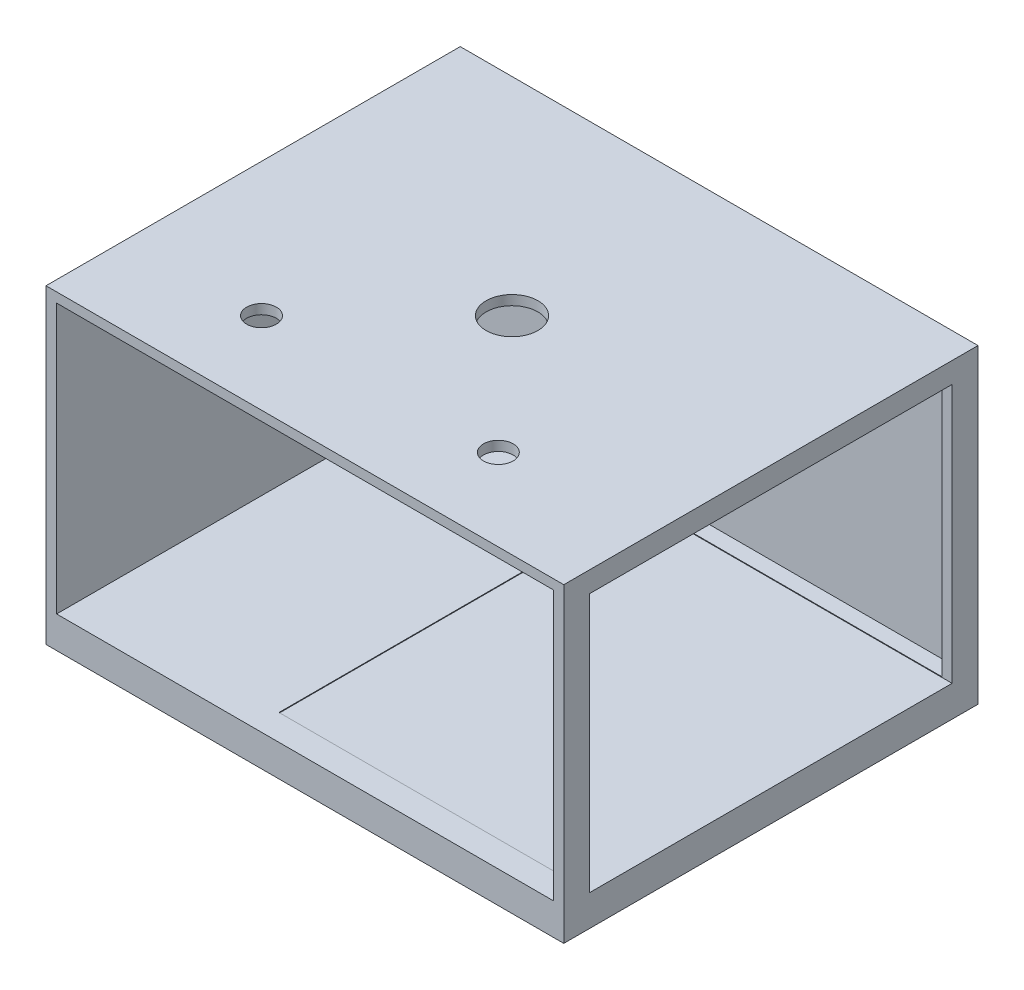
ISO-10303-21;
HEADER;
FILE_DESCRIPTION(('STEP AP214'),'2;1');
FILE_NAME('part.step','',(''),(''),'','','');
FILE_SCHEMA(('AUTOMOTIVE_DESIGN { 1 0 10303 214 1 1 1 1 }'));
ENDSEC;
DATA;
#1=APPLICATION_CONTEXT('core data for automotive mechanical design processes');
#2=APPLICATION_PROTOCOL_DEFINITION('international standard','automotive_design',2000,#1);
#3=PRODUCT_CONTEXT('',#1,'mechanical');
#4=PRODUCT('Part','Part','',(#3));
#5=PRODUCT_RELATED_PRODUCT_CATEGORY('part','',(#4));
#6=PRODUCT_DEFINITION_FORMATION('','',#4);
#7=PRODUCT_DEFINITION_CONTEXT('part definition',#1,'design');
#8=PRODUCT_DEFINITION('design','',#6,#7);
#9=PRODUCT_DEFINITION_SHAPE('','',#8);
#10=(LENGTH_UNIT() NAMED_UNIT(*) SI_UNIT(.MILLI.,.METRE.));
#11=(NAMED_UNIT(*) PLANE_ANGLE_UNIT() SI_UNIT($,.RADIAN.));
#12=(NAMED_UNIT(*) SI_UNIT($,.STERADIAN.) SOLID_ANGLE_UNIT());
#13=UNCERTAINTY_MEASURE_WITH_UNIT(LENGTH_MEASURE(1.E-05),#10,'distance_accuracy_value','');
#14=(GEOMETRIC_REPRESENTATION_CONTEXT(3) GLOBAL_UNCERTAINTY_ASSIGNED_CONTEXT((#13)) GLOBAL_UNIT_ASSIGNED_CONTEXT((#10,
#11,#12)) REPRESENTATION_CONTEXT('',''));
#15=CARTESIAN_POINT('',(0.,0.,0.));
#16=DIRECTION('',(0.,0.,1.));
#17=DIRECTION('',(1.,0.,0.));
#18=AXIS2_PLACEMENT_3D('',#15,#16,#17);
#19=CARTESIAN_POINT('',(250.,300.,-200.));
#20=DIRECTION('',(-1.,0.,0.));
#21=DIRECTION('',(0.,0.,1.));
#22=AXIS2_PLACEMENT_3D('',#19,#20,#21);
#23=PLANE('',#22);
#24=DIRECTION('',(0.,0.,1.));
#25=VECTOR('',#24,1.);
#26=CARTESIAN_POINT('',(250.,280.,175.));
#27=LINE('',#26,#25);
#28=CARTESIAN_POINT('',(250.,280.,-175.));
#29=VERTEX_POINT('',#28);
#30=CARTESIAN_POINT('',(250.,280.,175.));
#31=VERTEX_POINT('',#30);
#32=EDGE_CURVE('E163',#29,#31,#27,.T.);
#33=ORIENTED_EDGE('',*,*,#32,.F.);
#34=DIRECTION('',(0.,1.,0.));
#35=VECTOR('',#34,1.);
#36=CARTESIAN_POINT('',(250.,280.,-175.));
#37=LINE('',#36,#35);
#38=CARTESIAN_POINT('',(250.,30.,-175.));
#39=VERTEX_POINT('',#38);
#40=EDGE_CURVE('E49',#39,#29,#37,.T.);
#41=ORIENTED_EDGE('',*,*,#40,.F.);
#42=DIRECTION('',(0.,0.,-1.));
#43=VECTOR('',#42,1.);
#44=CARTESIAN_POINT('',(250.,30.,175.));
#45=LINE('',#44,#43);
#46=CARTESIAN_POINT('',(250.,30.,175.));
#47=VERTEX_POINT('',#46);
#48=EDGE_CURVE('E168',#47,#39,#45,.T.);
#49=ORIENTED_EDGE('',*,*,#48,.F.);
#50=DIRECTION('',(0.,-1.,0.));
#51=VECTOR('',#50,1.);
#52=CARTESIAN_POINT('',(250.,280.,175.));
#53=LINE('',#52,#51);
#54=EDGE_CURVE('E149',#31,#47,#53,.T.);
#55=ORIENTED_EDGE('',*,*,#54,.F.);
#56=EDGE_LOOP('',(#33,#41,#49,#55));
#57=FACE_BOUND('',#56,.T.);
#58=DIRECTION('',(0.,0.,-1.));
#59=VECTOR('',#58,1.);
#60=CARTESIAN_POINT('',(250.,0.,-200.));
#61=LINE('',#60,#59);
#62=CARTESIAN_POINT('',(250.,0.,200.));
#63=VERTEX_POINT('',#62);
#64=CARTESIAN_POINT('',(250.,0.,-200.));
#65=VERTEX_POINT('',#64);
#66=EDGE_CURVE('E205',#63,#65,#61,.T.);
#67=ORIENTED_EDGE('',*,*,#66,.T.);
#68=DIRECTION('',(0.,-1.,0.));
#69=VECTOR('',#68,1.);
#70=CARTESIAN_POINT('',(250.,300.,-200.));
#71=LINE('',#70,#69);
#72=CARTESIAN_POINT('',(250.,300.,-200.));
#73=VERTEX_POINT('',#72);
#74=EDGE_CURVE('E239',#73,#65,#71,.T.);
#75=ORIENTED_EDGE('',*,*,#74,.F.);
#76=DIRECTION('',(0.,0.,-1.));
#77=VECTOR('',#76,1.);
#78=CARTESIAN_POINT('',(250.,300.,-200.));
#79=LINE('',#78,#77);
#80=CARTESIAN_POINT('',(250.,300.,200.));
#81=VERTEX_POINT('',#80);
#82=EDGE_CURVE('E213',#81,#73,#79,.T.);
#83=ORIENTED_EDGE('',*,*,#82,.F.);
#84=DIRECTION('',(0.,-1.,0.));
#85=VECTOR('',#84,1.);
#86=CARTESIAN_POINT('',(250.,300.,200.));
#87=LINE('',#86,#85);
#88=EDGE_CURVE('E223',#81,#63,#87,.T.);
#89=ORIENTED_EDGE('',*,*,#88,.T.);
#90=EDGE_LOOP('',(#67,#75,#83,#89));
#91=FACE_BOUND('',#90,.T.);
#92=ADVANCED_FACE('F33',(#57,#91),#23,.F.);
#93=CARTESIAN_POINT('',(-250.,300.,-200.));
#94=DIRECTION('',(0.,0.,1.));
#95=DIRECTION('',(1.,0.,0.));
#96=AXIS2_PLACEMENT_3D('',#93,#94,#95);
#97=PLANE('',#96);
#98=DIRECTION('',(-1.,0.,0.));
#99=VECTOR('',#98,1.);
#100=CARTESIAN_POINT('',(-250.,0.,-200.));
#101=LINE('',#100,#99);
#102=CARTESIAN_POINT('',(-250.,0.,-200.));
#103=VERTEX_POINT('',#102);
#104=EDGE_CURVE('E226',#65,#103,#101,.T.);
#105=ORIENTED_EDGE('',*,*,#104,.T.);
#106=DIRECTION('',(0.,-1.,0.));
#107=VECTOR('',#106,1.);
#108=CARTESIAN_POINT('',(-250.,300.,-200.));
#109=LINE('',#108,#107);
#110=CARTESIAN_POINT('',(-250.,300.,-200.));
#111=VERTEX_POINT('',#110);
#112=EDGE_CURVE('E236',#111,#103,#109,.T.);
#113=ORIENTED_EDGE('',*,*,#112,.F.);
#114=DIRECTION('',(-1.,0.,0.));
#115=VECTOR('',#114,1.);
#116=CARTESIAN_POINT('',(-250.,300.,-200.));
#117=LINE('',#116,#115);
#118=EDGE_CURVE('E216',#73,#111,#117,.T.);
#119=ORIENTED_EDGE('',*,*,#118,.F.);
#120=ORIENTED_EDGE('',*,*,#74,.T.);
#121=EDGE_LOOP('',(#105,#113,#119,#120));
#122=FACE_BOUND('',#121,.T.);
#123=ADVANCED_FACE('F284',(#122),#97,.F.);
#124=CARTESIAN_POINT('',(-250.,300.,-200.));
#125=DIRECTION('',(1.,0.,0.));
#126=DIRECTION('',(0.,0.,-1.));
#127=AXIS2_PLACEMENT_3D('',#124,#125,#126);
#128=PLANE('',#127);
#129=DIRECTION('',(0.,0.,1.));
#130=VECTOR('',#129,1.);
#131=CARTESIAN_POINT('',(-250.,0.,-200.));
#132=LINE('',#131,#130);
#133=CARTESIAN_POINT('',(-250.,0.,200.));
#134=VERTEX_POINT('',#133);
#135=EDGE_CURVE('E228',#103,#134,#132,.T.);
#136=ORIENTED_EDGE('',*,*,#135,.T.);
#137=DIRECTION('',(0.,-1.,0.));
#138=VECTOR('',#137,1.);
#139=CARTESIAN_POINT('',(-250.,300.,200.));
#140=LINE('',#139,#138);
#141=CARTESIAN_POINT('',(-250.,300.,200.));
#142=VERTEX_POINT('',#141);
#143=EDGE_CURVE('E233',#142,#134,#140,.T.);
#144=ORIENTED_EDGE('',*,*,#143,.F.);
#145=DIRECTION('',(0.,0.,1.));
#146=VECTOR('',#145,1.);
#147=CARTESIAN_POINT('',(-250.,300.,-200.));
#148=LINE('',#147,#146);
#149=EDGE_CURVE('E219',#111,#142,#148,.T.);
#150=ORIENTED_EDGE('',*,*,#149,.F.);
#151=ORIENTED_EDGE('',*,*,#112,.T.);
#152=EDGE_LOOP('',(#136,#144,#150,#151));
#153=FACE_BOUND('',#152,.T.);
#154=ADVANCED_FACE('F289',(#153),#128,.F.);
#155=CARTESIAN_POINT('',(-250.,300.,200.));
#156=DIRECTION('',(0.,0.,-1.));
#157=DIRECTION('',(-1.,0.,0.));
#158=AXIS2_PLACEMENT_3D('',#155,#156,#157);
#159=PLANE('',#158);
#160=DIRECTION('',(-1.,0.,0.));
#161=VECTOR('',#160,1.);
#162=CARTESIAN_POINT('',(-239.738944774916,290.632083078125,200.));
#163=LINE('',#162,#161);
#164=CARTESIAN_POINT('',(240.261055225084,290.632083078125,200.));
#165=VERTEX_POINT('',#164);
#166=CARTESIAN_POINT('',(-239.738944774916,290.632083078125,200.));
#167=VERTEX_POINT('',#166);
#168=EDGE_CURVE('E194',#165,#167,#163,.T.);
#169=ORIENTED_EDGE('',*,*,#168,.F.);
#170=DIRECTION('',(0.,1.,0.));
#171=VECTOR('',#170,1.);
#172=CARTESIAN_POINT('',(240.261055225084,290.632083078125,200.));
#173=LINE('',#172,#171);
#174=CARTESIAN_POINT('',(240.261055225084,30.6320830781249,200.));
#175=VERTEX_POINT('',#174);
#176=EDGE_CURVE('E178',#175,#165,#173,.T.);
#177=ORIENTED_EDGE('',*,*,#176,.F.);
#178=DIRECTION('',(1.,0.,0.));
#179=VECTOR('',#178,1.);
#180=CARTESIAN_POINT('',(-239.738944774916,30.6320830781249,200.));
#181=LINE('',#180,#179);
#182=CARTESIAN_POINT('',(-239.738944774916,30.6320830781249,200.));
#183=VERTEX_POINT('',#182);
#184=EDGE_CURVE('E183',#183,#175,#181,.T.);
#185=ORIENTED_EDGE('',*,*,#184,.F.);
#186=DIRECTION('',(0.,-1.,0.));
#187=VECTOR('',#186,1.);
#188=CARTESIAN_POINT('',(-239.738944774916,290.632083078125,200.));
#189=LINE('',#188,#187);
#190=EDGE_CURVE('E197',#167,#183,#189,.T.);
#191=ORIENTED_EDGE('',*,*,#190,.F.);
#192=EDGE_LOOP('',(#169,#177,#185,#191));
#193=FACE_BOUND('',#192,.T.);
#194=DIRECTION('',(1.,0.,0.));
#195=VECTOR('',#194,1.);
#196=CARTESIAN_POINT('',(-250.,0.,200.));
#197=LINE('',#196,#195);
#198=EDGE_CURVE('E217',#134,#63,#197,.T.);
#199=ORIENTED_EDGE('',*,*,#198,.T.);
#200=ORIENTED_EDGE('',*,*,#88,.F.);
#201=DIRECTION('',(1.,0.,0.));
#202=VECTOR('',#201,1.);
#203=CARTESIAN_POINT('',(-250.,300.,200.));
#204=LINE('',#203,#202);
#205=EDGE_CURVE('E221',#142,#81,#204,.T.);
#206=ORIENTED_EDGE('',*,*,#205,.F.);
#207=ORIENTED_EDGE('',*,*,#143,.T.);
#208=EDGE_LOOP('',(#199,#200,#206,#207));
#209=FACE_BOUND('',#208,.T.);
#210=ADVANCED_FACE('F273',(#193,#209),#159,.F.);
#211=CARTESIAN_POINT('',(0.,300.,0.));
#212=DIRECTION('',(0.,1.,0.));
#213=DIRECTION('',(0.,0.,1.));
#214=AXIS2_PLACEMENT_3D('',#211,#212,#213);
#215=PLANE('',#214);
#216=CARTESIAN_POINT('',(-120.947499703319,300.,120.947499703318));
#217=DIRECTION('',(0.,1.,0.));
#218=DIRECTION('',(0.,0.,1.));
#219=AXIS2_PLACEMENT_3D('',#216,#217,#218);
#220=CIRCLE('',#219,14.3302724766965);
#221=CARTESIAN_POINT('',(-120.947499703319,300.,135.277772180014));
#222=VERTEX_POINT('',#221);
#223=EDGE_CURVE('E251',#222,#222,#220,.T.);
#224=ORIENTED_EDGE('',*,*,#223,.F.);
#225=EDGE_LOOP('',(#224));
#226=FACE_BOUND('',#225,.T.);
#227=CARTESIAN_POINT('',(107.763649024758,300.,120.947499703318));
#228=DIRECTION('',(0.,1.,0.));
#229=DIRECTION('',(0.,0.,1.));
#230=AXIS2_PLACEMENT_3D('',#227,#228,#229);
#231=CIRCLE('',#230,14.3302724766965);
#232=CARTESIAN_POINT('',(107.763649024758,300.,135.277772180014));
#233=VERTEX_POINT('',#232);
#234=EDGE_CURVE('E256',#233,#233,#231,.T.);
#235=ORIENTED_EDGE('',*,*,#234,.F.);
#236=EDGE_LOOP('',(#235));
#237=FACE_BOUND('',#236,.T.);
#238=CARTESIAN_POINT('',(0.,300.,0.));
#239=DIRECTION('',(0.,1.,0.));
#240=DIRECTION('',(0.,0.,1.));
#241=AXIS2_PLACEMENT_3D('',#238,#239,#240);
#242=CIRCLE('',#241,25.);
#243=CARTESIAN_POINT('',(0.,300.,25.));
#244=VERTEX_POINT('',#243);
#245=EDGE_CURVE('E248',#244,#244,#242,.T.);
#246=ORIENTED_EDGE('',*,*,#245,.F.);
#247=EDGE_LOOP('',(#246));
#248=FACE_BOUND('',#247,.T.);
#249=ORIENTED_EDGE('',*,*,#82,.T.);
#250=ORIENTED_EDGE('',*,*,#118,.T.);
#251=ORIENTED_EDGE('',*,*,#149,.T.);
#252=ORIENTED_EDGE('',*,*,#205,.T.);
#253=EDGE_LOOP('',(#249,#250,#251,#252));
#254=FACE_BOUND('',#253,.T.);
#255=ADVANCED_FACE('F269',(#226,#237,#248,#254),#215,.T.);
#256=CARTESIAN_POINT('',(0.,0.,0.));
#257=DIRECTION('',(0.,1.,0.));
#258=DIRECTION('',(0.,0.,1.));
#259=AXIS2_PLACEMENT_3D('',#256,#257,#258);
#260=PLANE('',#259);
#261=ORIENTED_EDGE('',*,*,#66,.F.);
#262=ORIENTED_EDGE('',*,*,#198,.F.);
#263=ORIENTED_EDGE('',*,*,#135,.F.);
#264=ORIENTED_EDGE('',*,*,#104,.F.);
#265=EDGE_LOOP('',(#261,#262,#263,#264));
#266=FACE_BOUND('',#265,.T.);
#267=ADVANCED_FACE('F272',(#266),#260,.F.);
#268=CARTESIAN_POINT('',(240.261055225084,290.632083078125,-190.));
#269=DIRECTION('',(1.,0.,0.));
#270=DIRECTION('',(0.,1.,0.));
#271=AXIS2_PLACEMENT_3D('',#268,#269,#270);
#272=PLANE('',#271);
#273=DIRECTION('',(0.,0.,1.));
#274=VECTOR('',#273,1.);
#275=CARTESIAN_POINT('',(240.261055225084,30.6320830781249,-190.));
#276=LINE('',#275,#274);
#277=CARTESIAN_POINT('',(240.261055225084,30.6320830781249,-190.));
#278=VERTEX_POINT('',#277);
#279=CARTESIAN_POINT('',(240.261055225084,30.6320830781249,-175.));
#280=VERTEX_POINT('',#279);
#281=EDGE_CURVE('E202',#278,#280,#276,.T.);
#282=ORIENTED_EDGE('',*,*,#281,.T.);
#283=DIRECTION('',(0.,1.,0.));
#284=VECTOR('',#283,1.);
#285=CARTESIAN_POINT('',(240.261055225084,290.632083078125,-175.));
#286=LINE('',#285,#284);
#287=CARTESIAN_POINT('',(240.261055225084,280.,-175.));
#288=VERTEX_POINT('',#287);
#289=EDGE_CURVE('E175',#280,#288,#286,.T.);
#290=ORIENTED_EDGE('',*,*,#289,.T.);
#291=DIRECTION('',(0.,0.,1.));
#292=VECTOR('',#291,1.);
#293=CARTESIAN_POINT('',(240.261055225084,280.,-190.));
#294=LINE('',#293,#292);
#295=CARTESIAN_POINT('',(240.261055225084,280.,175.));
#296=VERTEX_POINT('',#295);
#297=EDGE_CURVE('E11',#288,#296,#294,.T.);
#298=ORIENTED_EDGE('',*,*,#297,.T.);
#299=DIRECTION('',(0.,-1.,0.));
#300=VECTOR('',#299,1.);
#301=CARTESIAN_POINT('',(240.261055225084,290.632083078125,175.));
#302=LINE('',#301,#300);
#303=CARTESIAN_POINT('',(240.261055225084,30.6320830781249,175.));
#304=VERTEX_POINT('',#303);
#305=EDGE_CURVE('E170',#296,#304,#302,.T.);
#306=ORIENTED_EDGE('',*,*,#305,.T.);
#307=EDGE_CURVE('E206',#304,#175,#276,.T.);
#308=ORIENTED_EDGE('',*,*,#307,.T.);
#309=ORIENTED_EDGE('',*,*,#176,.T.);
#310=DIRECTION('',(0.,0.,1.));
#311=VECTOR('',#310,1.);
#312=CARTESIAN_POINT('',(240.261055225084,290.632083078125,-190.));
#313=LINE('',#312,#311);
#314=CARTESIAN_POINT('',(240.261055225084,290.632083078125,-190.));
#315=VERTEX_POINT('',#314);
#316=EDGE_CURVE('E192',#315,#165,#313,.T.);
#317=ORIENTED_EDGE('',*,*,#316,.F.);
#318=DIRECTION('',(0.,1.,0.));
#319=VECTOR('',#318,1.);
#320=CARTESIAN_POINT('',(240.261055225084,290.632083078125,-190.));
#321=LINE('',#320,#319);
#322=EDGE_CURVE('E179',#278,#315,#321,.T.);
#323=ORIENTED_EDGE('',*,*,#322,.F.);
#324=EDGE_LOOP('',(#282,#290,#298,#306,#308,#309,#317,#323));
#325=FACE_BOUND('',#324,.T.);
#326=ADVANCED_FACE('F294',(#325),#272,.F.);
#327=CARTESIAN_POINT('',(-239.738944774916,30.6320830781249,-190.));
#328=DIRECTION('',(0.,-1.,0.));
#329=DIRECTION('',(0.,0.,-1.));
#330=AXIS2_PLACEMENT_3D('',#327,#328,#329);
#331=PLANE('',#330);
#332=DIRECTION('',(0.,0.,1.));
#333=VECTOR('',#332,1.);
#334=CARTESIAN_POINT('',(-50.,30.6320830781249,-190.));
#335=LINE('',#334,#333);
#336=CARTESIAN_POINT('',(-50.,30.6320830781249,-175.));
#337=VERTEX_POINT('',#336);
#338=CARTESIAN_POINT('',(-50.,30.6320830781249,175.));
#339=VERTEX_POINT('',#338);
#340=EDGE_CURVE('E141',#337,#339,#335,.T.);
#341=ORIENTED_EDGE('',*,*,#340,.F.);
#342=DIRECTION('',(1.,0.,0.));
#343=VECTOR('',#342,1.);
#344=CARTESIAN_POINT('',(-239.738944774916,30.6320830781249,-175.));
#345=LINE('',#344,#343);
#346=EDGE_CURVE('E41',#337,#280,#345,.T.);
#347=ORIENTED_EDGE('',*,*,#346,.T.);
#348=ORIENTED_EDGE('',*,*,#281,.F.);
#349=DIRECTION('',(1.,0.,0.));
#350=VECTOR('',#349,1.);
#351=CARTESIAN_POINT('',(-239.738944774916,30.6320830781249,-190.));
#352=LINE('',#351,#350);
#353=CARTESIAN_POINT('',(-239.738944774916,30.6320830781249,-190.));
#354=VERTEX_POINT('',#353);
#355=EDGE_CURVE('E189',#354,#278,#352,.T.);
#356=ORIENTED_EDGE('',*,*,#355,.F.);
#357=DIRECTION('',(0.,0.,1.));
#358=VECTOR('',#357,1.);
#359=CARTESIAN_POINT('',(-239.738944774916,30.6320830781249,-190.));
#360=LINE('',#359,#358);
#361=EDGE_CURVE('E207',#354,#183,#360,.T.);
#362=ORIENTED_EDGE('',*,*,#361,.T.);
#363=ORIENTED_EDGE('',*,*,#184,.T.);
#364=ORIENTED_EDGE('',*,*,#307,.F.);
#365=DIRECTION('',(-1.,0.,0.));
#366=VECTOR('',#365,1.);
#367=CARTESIAN_POINT('',(-239.738944774916,30.6320830781249,175.));
#368=LINE('',#367,#366);
#369=EDGE_CURVE('E243',#304,#339,#368,.T.);
#370=ORIENTED_EDGE('',*,*,#369,.T.);
#371=EDGE_LOOP('',(#341,#347,#348,#356,#362,#363,#364,#370));
#372=FACE_BOUND('',#371,.T.);
#373=ADVANCED_FACE('F300',(#372),#331,.F.);
#374=CARTESIAN_POINT('',(-239.738944774916,290.632083078125,-190.));
#375=DIRECTION('',(-1.,0.,0.));
#376=DIRECTION('',(0.,-1.,0.));
#377=AXIS2_PLACEMENT_3D('',#374,#375,#376);
#378=PLANE('',#377);
#379=ORIENTED_EDGE('',*,*,#190,.T.);
#380=ORIENTED_EDGE('',*,*,#361,.F.);
#381=DIRECTION('',(0.,-1.,0.));
#382=VECTOR('',#381,1.);
#383=CARTESIAN_POINT('',(-239.738944774916,290.632083078125,-190.));
#384=LINE('',#383,#382);
#385=CARTESIAN_POINT('',(-239.738944774916,290.632083078125,-190.));
#386=VERTEX_POINT('',#385);
#387=EDGE_CURVE('E186',#386,#354,#384,.T.);
#388=ORIENTED_EDGE('',*,*,#387,.F.);
#389=DIRECTION('',(0.,0.,1.));
#390=VECTOR('',#389,1.);
#391=CARTESIAN_POINT('',(-239.738944774916,290.632083078125,-190.));
#392=LINE('',#391,#390);
#393=EDGE_CURVE('E209',#386,#167,#392,.T.);
#394=ORIENTED_EDGE('',*,*,#393,.T.);
#395=EDGE_LOOP('',(#379,#380,#388,#394));
#396=FACE_BOUND('',#395,.T.);
#397=ADVANCED_FACE('F330',(#396),#378,.F.);
#398=CARTESIAN_POINT('',(-239.738944774916,290.632083078125,-190.));
#399=DIRECTION('',(0.,1.,0.));
#400=DIRECTION('',(0.,0.,1.));
#401=AXIS2_PLACEMENT_3D('',#398,#399,#400);
#402=PLANE('',#401);
#403=CARTESIAN_POINT('',(-120.947499703319,290.632083078125,120.947499703318));
#404=DIRECTION('',(0.,1.,0.));
#405=DIRECTION('',(0.,0.,1.));
#406=AXIS2_PLACEMENT_3D('',#403,#404,#405);
#407=CIRCLE('',#406,14.3302724766965);
#408=CARTESIAN_POINT('',(-120.947499703319,290.632083078125,135.277772180014));
#409=VERTEX_POINT('',#408);
#410=EDGE_CURVE('E36',#409,#409,#407,.T.);
#411=ORIENTED_EDGE('',*,*,#410,.T.);
#412=EDGE_LOOP('',(#411));
#413=FACE_BOUND('',#412,.T.);
#414=CARTESIAN_POINT('',(107.763649024758,290.632083078125,120.947499703318));
#415=DIRECTION('',(0.,1.,0.));
#416=DIRECTION('',(0.,0.,1.));
#417=AXIS2_PLACEMENT_3D('',#414,#415,#416);
#418=CIRCLE('',#417,14.3302724766965);
#419=CARTESIAN_POINT('',(107.763649024758,290.632083078125,135.277772180014));
#420=VERTEX_POINT('',#419);
#421=EDGE_CURVE('E249',#420,#420,#418,.T.);
#422=ORIENTED_EDGE('',*,*,#421,.T.);
#423=EDGE_LOOP('',(#422));
#424=FACE_BOUND('',#423,.T.);
#425=CARTESIAN_POINT('',(0.,290.632083078125,0.));
#426=DIRECTION('',(0.,1.,0.));
#427=DIRECTION('',(0.,0.,1.));
#428=AXIS2_PLACEMENT_3D('',#425,#426,#427);
#429=CIRCLE('',#428,25.);
#430=CARTESIAN_POINT('',(0.,290.632083078125,25.));
#431=VERTEX_POINT('',#430);
#432=EDGE_CURVE('E164',#431,#431,#429,.T.);
#433=ORIENTED_EDGE('',*,*,#432,.T.);
#434=EDGE_LOOP('',(#433));
#435=FACE_BOUND('',#434,.T.);
#436=ORIENTED_EDGE('',*,*,#168,.T.);
#437=ORIENTED_EDGE('',*,*,#393,.F.);
#438=DIRECTION('',(-1.,0.,0.));
#439=VECTOR('',#438,1.);
#440=CARTESIAN_POINT('',(-239.738944774916,290.632083078125,-190.));
#441=LINE('',#440,#439);
#442=EDGE_CURVE('E182',#315,#386,#441,.T.);
#443=ORIENTED_EDGE('',*,*,#442,.F.);
#444=ORIENTED_EDGE('',*,*,#316,.T.);
#445=EDGE_LOOP('',(#436,#437,#443,#444));
#446=FACE_BOUND('',#445,.T.);
#447=ADVANCED_FACE('F324',(#413,#424,#435,#446),#402,.F.);
#448=CARTESIAN_POINT('',(0.,0.,-190.));
#449=DIRECTION('',(0.,0.,1.));
#450=DIRECTION('',(1.,0.,0.));
#451=AXIS2_PLACEMENT_3D('',#448,#449,#450);
#452=PLANE('',#451);
#453=ORIENTED_EDGE('',*,*,#322,.T.);
#454=ORIENTED_EDGE('',*,*,#442,.T.);
#455=ORIENTED_EDGE('',*,*,#387,.T.);
#456=ORIENTED_EDGE('',*,*,#355,.T.);
#457=EDGE_LOOP('',(#453,#454,#455,#456));
#458=FACE_BOUND('',#457,.T.);
#459=ADVANCED_FACE('F328',(#458),#452,.T.);
#460=CARTESIAN_POINT('',(-50.,280.,175.));
#461=DIRECTION('',(0.,1.,0.));
#462=DIRECTION('',(0.,0.,1.));
#463=AXIS2_PLACEMENT_3D('',#460,#461,#462);
#464=PLANE('',#463);
#465=DIRECTION('',(1.,0.,0.));
#466=VECTOR('',#465,1.);
#467=CARTESIAN_POINT('',(-50.,280.,-175.));
#468=LINE('',#467,#466);
#469=EDGE_CURVE('E157',#288,#29,#468,.T.);
#470=ORIENTED_EDGE('',*,*,#469,.T.);
#471=ORIENTED_EDGE('',*,*,#32,.T.);
#472=DIRECTION('',(1.,0.,0.));
#473=VECTOR('',#472,1.);
#474=CARTESIAN_POINT('',(-50.,280.,175.));
#475=LINE('',#474,#473);
#476=EDGE_CURVE('E154',#296,#31,#475,.T.);
#477=ORIENTED_EDGE('',*,*,#476,.F.);
#478=ORIENTED_EDGE('',*,*,#297,.F.);
#479=EDGE_LOOP('',(#470,#471,#477,#478));
#480=FACE_BOUND('',#479,.T.);
#481=ADVANCED_FACE('F312',(#480),#464,.F.);
#482=CARTESIAN_POINT('',(-50.,280.,-175.));
#483=DIRECTION('',(0.,0.,-1.));
#484=DIRECTION('',(-1.,0.,0.));
#485=AXIS2_PLACEMENT_3D('',#482,#483,#484);
#486=PLANE('',#485);
#487=ORIENTED_EDGE('',*,*,#346,.F.);
#488=DIRECTION('',(0.,1.,0.));
#489=VECTOR('',#488,1.);
#490=CARTESIAN_POINT('',(-50.,280.,-175.));
#491=LINE('',#490,#489);
#492=CARTESIAN_POINT('',(-50.,30.,-175.));
#493=VERTEX_POINT('',#492);
#494=EDGE_CURVE('E57',#493,#337,#491,.T.);
#495=ORIENTED_EDGE('',*,*,#494,.F.);
#496=DIRECTION('',(1.,0.,0.));
#497=VECTOR('',#496,1.);
#498=CARTESIAN_POINT('',(-50.,30.,-175.));
#499=LINE('',#498,#497);
#500=EDGE_CURVE('E153',#493,#39,#499,.T.);
#501=ORIENTED_EDGE('',*,*,#500,.T.);
#502=ORIENTED_EDGE('',*,*,#40,.T.);
#503=ORIENTED_EDGE('',*,*,#469,.F.);
#504=ORIENTED_EDGE('',*,*,#289,.F.);
#505=EDGE_LOOP('',(#487,#495,#501,#502,#503,#504));
#506=FACE_BOUND('',#505,.T.);
#507=ADVANCED_FACE('F313',(#506),#486,.F.);
#508=CARTESIAN_POINT('',(-50.,280.,175.));
#509=DIRECTION('',(0.,0.,1.));
#510=DIRECTION('',(1.,0.,0.));
#511=AXIS2_PLACEMENT_3D('',#508,#509,#510);
#512=PLANE('',#511);
#513=ORIENTED_EDGE('',*,*,#476,.T.);
#514=ORIENTED_EDGE('',*,*,#54,.T.);
#515=DIRECTION('',(1.,0.,0.));
#516=VECTOR('',#515,1.);
#517=CARTESIAN_POINT('',(-50.,30.,175.));
#518=LINE('',#517,#516);
#519=CARTESIAN_POINT('',(-50.,30.,175.));
#520=VERTEX_POINT('',#519);
#521=EDGE_CURVE('E146',#520,#47,#518,.T.);
#522=ORIENTED_EDGE('',*,*,#521,.F.);
#523=DIRECTION('',(0.,-1.,0.));
#524=VECTOR('',#523,1.);
#525=CARTESIAN_POINT('',(-50.,280.,175.));
#526=LINE('',#525,#524);
#527=EDGE_CURVE('E135',#339,#520,#526,.T.);
#528=ORIENTED_EDGE('',*,*,#527,.F.);
#529=ORIENTED_EDGE('',*,*,#369,.F.);
#530=ORIENTED_EDGE('',*,*,#305,.F.);
#531=EDGE_LOOP('',(#513,#514,#522,#528,#529,#530));
#532=FACE_BOUND('',#531,.T.);
#533=ADVANCED_FACE('F147',(#532),#512,.F.);
#534=CARTESIAN_POINT('',(-50.,0.,0.));
#535=DIRECTION('',(1.,0.,0.));
#536=DIRECTION('',(0.,0.,-1.));
#537=AXIS2_PLACEMENT_3D('',#534,#535,#536);
#538=PLANE('',#537);
#539=ORIENTED_EDGE('',*,*,#340,.T.);
#540=ORIENTED_EDGE('',*,*,#527,.T.);
#541=DIRECTION('',(0.,0.,-1.));
#542=VECTOR('',#541,1.);
#543=CARTESIAN_POINT('',(-50.,30.,175.));
#544=LINE('',#543,#542);
#545=EDGE_CURVE('E139',#520,#493,#544,.T.);
#546=ORIENTED_EDGE('',*,*,#545,.T.);
#547=ORIENTED_EDGE('',*,*,#494,.T.);
#548=EDGE_LOOP('',(#539,#540,#546,#547));
#549=FACE_BOUND('',#548,.T.);
#550=ADVANCED_FACE('F137',(#549),#538,.T.);
#551=CARTESIAN_POINT('',(-50.,30.,175.));
#552=DIRECTION('',(0.,-1.,0.));
#553=DIRECTION('',(0.,0.,-1.));
#554=AXIS2_PLACEMENT_3D('',#551,#552,#553);
#555=PLANE('',#554);
#556=ORIENTED_EDGE('',*,*,#48,.T.);
#557=ORIENTED_EDGE('',*,*,#500,.F.);
#558=ORIENTED_EDGE('',*,*,#545,.F.);
#559=ORIENTED_EDGE('',*,*,#521,.T.);
#560=EDGE_LOOP('',(#556,#557,#558,#559));
#561=FACE_BOUND('',#560,.T.);
#562=ADVANCED_FACE('F156',(#561),#555,.F.);
#563=CARTESIAN_POINT('',(0.,90.0000000000001,0.));
#564=DIRECTION('',(0.,1.,0.));
#565=DIRECTION('',(0.,0.,1.));
#566=AXIS2_PLACEMENT_3D('',#563,#564,#565);
#567=CYLINDRICAL_SURFACE('',#566,25.);
#568=CARTESIAN_POINT('',(0.,300.,25.));
#569=CARTESIAN_POINT('',(0.,299.902417532064,25.));
#570=CARTESIAN_POINT('',(0.,299.804835064128,25.));
#571=CARTESIAN_POINT('',(0.,299.609670128255,25.));
#572=CARTESIAN_POINT('',(0.,299.512087660319,25.));
#573=CARTESIAN_POINT('',(0.,299.316922724447,25.));
#574=CARTESIAN_POINT('',(0.,299.21934025651,25.));
#575=CARTESIAN_POINT('',(0.,299.024175320638,25.));
#576=CARTESIAN_POINT('',(0.,298.926592852702,25.));
#577=CARTESIAN_POINT('',(0.,298.731427916829,25.));
#578=CARTESIAN_POINT('',(0.,298.633845448893,25.));
#579=CARTESIAN_POINT('',(0.,298.438680513021,25.));
#580=CARTESIAN_POINT('',(0.,298.341098045085,25.));
#581=CARTESIAN_POINT('',(0.,298.145933109212,25.));
#582=CARTESIAN_POINT('',(0.,298.048350641276,25.));
#583=CARTESIAN_POINT('',(0.,297.853185705404,25.));
#584=CARTESIAN_POINT('',(0.,297.755603237467,25.));
#585=CARTESIAN_POINT('',(0.,297.560438301595,25.));
#586=CARTESIAN_POINT('',(0.,297.462855833659,25.));
#587=CARTESIAN_POINT('',(0.,297.267690897786,25.));
#588=CARTESIAN_POINT('',(0.,297.17010842985,25.));
#589=CARTESIAN_POINT('',(0.,296.974943493978,25.));
#590=CARTESIAN_POINT('',(0.,296.877361026042,25.));
#591=CARTESIAN_POINT('',(0.,296.682196090169,25.));
#592=CARTESIAN_POINT('',(0.,296.584613622233,25.));
#593=CARTESIAN_POINT('',(0.,296.389448686361,25.));
#594=CARTESIAN_POINT('',(0.,296.291866218424,25.));
#595=CARTESIAN_POINT('',(0.,296.096701282552,25.));
#596=CARTESIAN_POINT('',(0.,295.999118814616,25.));
#597=CARTESIAN_POINT('',(0.,295.803953878743,25.));
#598=CARTESIAN_POINT('',(0.,295.706371410807,25.));
#599=CARTESIAN_POINT('',(0.,295.511206474935,25.));
#600=CARTESIAN_POINT('',(0.,295.413624006999,25.));
#601=CARTESIAN_POINT('',(0.,295.218459071126,25.));
#602=CARTESIAN_POINT('',(0.,295.12087660319,25.));
#603=CARTESIAN_POINT('',(0.,294.925711667318,25.));
#604=CARTESIAN_POINT('',(0.,294.828129199381,25.));
#605=CARTESIAN_POINT('',(0.,294.632964263509,25.));
#606=CARTESIAN_POINT('',(0.,294.535381795573,25.));
#607=CARTESIAN_POINT('',(0.,294.3402168597,25.));
#608=CARTESIAN_POINT('',(0.,294.242634391764,25.));
#609=CARTESIAN_POINT('',(0.,294.047469455892,25.));
#610=CARTESIAN_POINT('',(0.,293.949886987956,25.));
#611=CARTESIAN_POINT('',(0.,293.754722052083,25.));
#612=CARTESIAN_POINT('',(0.,293.657139584147,25.));
#613=CARTESIAN_POINT('',(0.,293.461974648275,25.));
#614=CARTESIAN_POINT('',(0.,293.364392180338,25.));
#615=CARTESIAN_POINT('',(0.,293.169227244466,25.));
#616=CARTESIAN_POINT('',(0.,293.07164477653,25.));
#617=CARTESIAN_POINT('',(0.,292.876479840657,25.));
#618=CARTESIAN_POINT('',(0.,292.778897372721,25.));
#619=CARTESIAN_POINT('',(0.,292.583732436849,25.));
#620=CARTESIAN_POINT('',(0.,292.486149968913,25.));
#621=CARTESIAN_POINT('',(0.,292.29098503304,25.));
#622=CARTESIAN_POINT('',(0.,292.193402565104,25.));
#623=CARTESIAN_POINT('',(0.,291.998237629232,25.));
#624=CARTESIAN_POINT('',(0.,291.900655161295,25.));
#625=CARTESIAN_POINT('',(0.,291.705490225423,25.));
#626=CARTESIAN_POINT('',(0.,291.607907757487,25.));
#627=CARTESIAN_POINT('',(0.,291.412742821614,25.));
#628=CARTESIAN_POINT('',(0.,291.315160353678,25.));
#629=CARTESIAN_POINT('',(0.,291.119995417806,25.));
#630=CARTESIAN_POINT('',(0.,291.02241294987,25.));
#631=CARTESIAN_POINT('',(0.,290.827248013997,25.));
#632=CARTESIAN_POINT('',(0.,290.729665546061,25.));
#633=CARTESIAN_POINT('',(0.,290.632083078125,25.));
#634=B_SPLINE_CURVE_WITH_KNOTS('',3,(#568,#569,#570,#571,#572,#573,#574,#575,#576,#577,#578,
#579,#580,#581,#582,#583,#584,#585,#586,#587,#588,#589,#590,#591,#592,#593,#594,#595,#596,#597,
#598,#599,#600,#601,#602,#603,#604,#605,#606,#607,#608,#609,#610,#611,#612,#613,#614,#615,#616,
#617,#618,#619,#620,#621,#622,#623,#624,#625,#626,#627,#628,#629,#630,#631,#632,#633),
.UNSPECIFIED.,.F.,.F.,(4,2,2,2,2,2,2,2,2,2,2,2,2,2,2,2,2,2,2,2,2,2,2,2,2,2,2,2,2,2,2,2,4),(0.,
0.29274740380858,0.58549480761716,0.878242211425739,1.17098961523432,1.46373701904295,
1.75648442285159,2.04923182666017,2.34197923046875,2.63472663427733,2.92747403808591,
3.22022144189454,3.51296884570318,3.80571624951176,4.09846365332034,4.39121105712892,
4.6839584609375,4.97670586474613,5.26945326855471,5.56220067236335,5.85494807617193,
6.14769547998051,6.44044288378909,6.73319028759767,7.0259376914063,7.31868509521494,
7.61143249902352,7.9041799028321,8.19692730664068,8.48967471044926,8.78242211425789,
9.07516951806647,9.36791692187511),.UNSPECIFIED.);
#635=EDGE_CURVE('BSEAM266',#244,#431,#634,.T.);
#636=ORIENTED_EDGE('',*,*,#245,.T.);
#637=ORIENTED_EDGE('',*,*,#432,.F.);
#638=ORIENTED_EDGE('',*,*,#635,.T.);
#639=ORIENTED_EDGE('',*,*,#635,.F.);
#640=EDGE_LOOP('',(#636,#638,#637,#639));
#641=FACE_BOUND('',#640,.T.);
#642=ADVANCED_FACE('F266',(#641),#567,.F.);
#643=CARTESIAN_POINT('',(107.763649024758,90.0000000000001,120.947499703318));
#644=DIRECTION('',(0.,1.,0.));
#645=DIRECTION('',(0.,0.,1.));
#646=AXIS2_PLACEMENT_3D('',#643,#644,#645);
#647=CYLINDRICAL_SURFACE('',#646,14.3302724766965);
#648=CARTESIAN_POINT('',(107.763649024758,300.,135.277772180014));
#649=CARTESIAN_POINT('',(107.763649024758,299.902417532064,135.277772180014));
#650=CARTESIAN_POINT('',(107.763649024758,299.804835064128,135.277772180014));
#651=CARTESIAN_POINT('',(107.763649024758,299.609670128255,135.277772180014));
#652=CARTESIAN_POINT('',(107.763649024758,299.512087660319,135.277772180014));
#653=CARTESIAN_POINT('',(107.763649024758,299.316922724447,135.277772180014));
#654=CARTESIAN_POINT('',(107.763649024758,299.21934025651,135.277772180014));
#655=CARTESIAN_POINT('',(107.763649024758,299.024175320638,135.277772180014));
#656=CARTESIAN_POINT('',(107.763649024758,298.926592852702,135.277772180014));
#657=CARTESIAN_POINT('',(107.763649024758,298.731427916829,135.277772180014));
#658=CARTESIAN_POINT('',(107.763649024758,298.633845448893,135.277772180014));
#659=CARTESIAN_POINT('',(107.763649024758,298.438680513021,135.277772180014));
#660=CARTESIAN_POINT('',(107.763649024758,298.341098045085,135.277772180014));
#661=CARTESIAN_POINT('',(107.763649024758,298.145933109212,135.277772180014));
#662=CARTESIAN_POINT('',(107.763649024758,298.048350641276,135.277772180014));
#663=CARTESIAN_POINT('',(107.763649024758,297.853185705404,135.277772180014));
#664=CARTESIAN_POINT('',(107.763649024758,297.755603237467,135.277772180014));
#665=CARTESIAN_POINT('',(107.763649024758,297.560438301595,135.277772180014));
#666=CARTESIAN_POINT('',(107.763649024758,297.462855833659,135.277772180014));
#667=CARTESIAN_POINT('',(107.763649024758,297.267690897786,135.277772180014));
#668=CARTESIAN_POINT('',(107.763649024758,297.17010842985,135.277772180014));
#669=CARTESIAN_POINT('',(107.763649024758,296.974943493978,135.277772180014));
#670=CARTESIAN_POINT('',(107.763649024758,296.877361026042,135.277772180014));
#671=CARTESIAN_POINT('',(107.763649024758,296.682196090169,135.277772180014));
#672=CARTESIAN_POINT('',(107.763649024758,296.584613622233,135.277772180014));
#673=CARTESIAN_POINT('',(107.763649024758,296.389448686361,135.277772180014));
#674=CARTESIAN_POINT('',(107.763649024758,296.291866218424,135.277772180014));
#675=CARTESIAN_POINT('',(107.763649024758,296.096701282552,135.277772180014));
#676=CARTESIAN_POINT('',(107.763649024758,295.999118814616,135.277772180014));
#677=CARTESIAN_POINT('',(107.763649024758,295.803953878743,135.277772180014));
#678=CARTESIAN_POINT('',(107.763649024758,295.706371410807,135.277772180014));
#679=CARTESIAN_POINT('',(107.763649024758,295.511206474935,135.277772180014));
#680=CARTESIAN_POINT('',(107.763649024758,295.413624006999,135.277772180014));
#681=CARTESIAN_POINT('',(107.763649024758,295.218459071126,135.277772180014));
#682=CARTESIAN_POINT('',(107.763649024758,295.12087660319,135.277772180014));
#683=CARTESIAN_POINT('',(107.763649024758,294.925711667318,135.277772180014));
#684=CARTESIAN_POINT('',(107.763649024758,294.828129199381,135.277772180014));
#685=CARTESIAN_POINT('',(107.763649024758,294.632964263509,135.277772180014));
#686=CARTESIAN_POINT('',(107.763649024758,294.535381795573,135.277772180014));
#687=CARTESIAN_POINT('',(107.763649024758,294.3402168597,135.277772180014));
#688=CARTESIAN_POINT('',(107.763649024758,294.242634391764,135.277772180014));
#689=CARTESIAN_POINT('',(107.763649024758,294.047469455892,135.277772180014));
#690=CARTESIAN_POINT('',(107.763649024758,293.949886987956,135.277772180014));
#691=CARTESIAN_POINT('',(107.763649024758,293.754722052083,135.277772180014));
#692=CARTESIAN_POINT('',(107.763649024758,293.657139584147,135.277772180014));
#693=CARTESIAN_POINT('',(107.763649024758,293.461974648275,135.277772180014));
#694=CARTESIAN_POINT('',(107.763649024758,293.364392180338,135.277772180014));
#695=CARTESIAN_POINT('',(107.763649024758,293.169227244466,135.277772180014));
#696=CARTESIAN_POINT('',(107.763649024758,293.07164477653,135.277772180014));
#697=CARTESIAN_POINT('',(107.763649024758,292.876479840657,135.277772180014));
#698=CARTESIAN_POINT('',(107.763649024758,292.778897372721,135.277772180014));
#699=CARTESIAN_POINT('',(107.763649024758,292.583732436849,135.277772180014));
#700=CARTESIAN_POINT('',(107.763649024758,292.486149968913,135.277772180014));
#701=CARTESIAN_POINT('',(107.763649024758,292.29098503304,135.277772180014));
#702=CARTESIAN_POINT('',(107.763649024758,292.193402565104,135.277772180014));
#703=CARTESIAN_POINT('',(107.763649024758,291.998237629232,135.277772180014));
#704=CARTESIAN_POINT('',(107.763649024758,291.900655161295,135.277772180014));
#705=CARTESIAN_POINT('',(107.763649024758,291.705490225423,135.277772180014));
#706=CARTESIAN_POINT('',(107.763649024758,291.607907757487,135.277772180014));
#707=CARTESIAN_POINT('',(107.763649024758,291.412742821614,135.277772180014));
#708=CARTESIAN_POINT('',(107.763649024758,291.315160353678,135.277772180014));
#709=CARTESIAN_POINT('',(107.763649024758,291.119995417806,135.277772180014));
#710=CARTESIAN_POINT('',(107.763649024758,291.02241294987,135.277772180014));
#711=CARTESIAN_POINT('',(107.763649024758,290.827248013997,135.277772180014));
#712=CARTESIAN_POINT('',(107.763649024758,290.729665546061,135.277772180014));
#713=CARTESIAN_POINT('',(107.763649024758,290.632083078125,135.277772180014));
#714=B_SPLINE_CURVE_WITH_KNOTS('',3,(#648,#649,#650,#651,#652,#653,#654,#655,#656,#657,#658,
#659,#660,#661,#662,#663,#664,#665,#666,#667,#668,#669,#670,#671,#672,#673,#674,#675,#676,#677,
#678,#679,#680,#681,#682,#683,#684,#685,#686,#687,#688,#689,#690,#691,#692,#693,#694,#695,#696,
#697,#698,#699,#700,#701,#702,#703,#704,#705,#706,#707,#708,#709,#710,#711,#712,#713),
.UNSPECIFIED.,.F.,.F.,(4,2,2,2,2,2,2,2,2,2,2,2,2,2,2,2,2,2,2,2,2,2,2,2,2,2,2,2,2,2,2,2,4),(0.,
0.29274740380858,0.58549480761716,0.878242211425739,1.17098961523432,1.46373701904295,
1.75648442285159,2.04923182666017,2.34197923046875,2.63472663427733,2.92747403808591,
3.22022144189454,3.51296884570318,3.80571624951176,4.09846365332034,4.39121105712892,
4.6839584609375,4.97670586474613,5.26945326855471,5.56220067236335,5.85494807617193,
6.14769547998051,6.44044288378909,6.73319028759767,7.0259376914063,7.31868509521494,
7.61143249902352,7.9041799028321,8.19692730664068,8.48967471044926,8.78242211425789,
9.07516951806647,9.36791692187511),.UNSPECIFIED.);
#715=EDGE_CURVE('BSEAM356',#233,#420,#714,.T.);
#716=ORIENTED_EDGE('',*,*,#234,.T.);
#717=ORIENTED_EDGE('',*,*,#421,.F.);
#718=ORIENTED_EDGE('',*,*,#715,.T.);
#719=ORIENTED_EDGE('',*,*,#715,.F.);
#720=EDGE_LOOP('',(#716,#718,#717,#719));
#721=FACE_BOUND('',#720,.T.);
#722=ADVANCED_FACE('F356',(#721),#647,.F.);
#723=CARTESIAN_POINT('',(-120.947499703319,90.0000000000001,120.947499703318));
#724=DIRECTION('',(0.,1.,0.));
#725=DIRECTION('',(0.,0.,1.));
#726=AXIS2_PLACEMENT_3D('',#723,#724,#725);
#727=CYLINDRICAL_SURFACE('',#726,14.3302724766965);
#728=CARTESIAN_POINT('',(-120.947499703319,300.,135.277772180014));
#729=CARTESIAN_POINT('',(-120.947499703319,299.902417532064,135.277772180014));
#730=CARTESIAN_POINT('',(-120.947499703319,299.804835064128,135.277772180014));
#731=CARTESIAN_POINT('',(-120.947499703319,299.609670128255,135.277772180014));
#732=CARTESIAN_POINT('',(-120.947499703319,299.512087660319,135.277772180014));
#733=CARTESIAN_POINT('',(-120.947499703319,299.316922724447,135.277772180014));
#734=CARTESIAN_POINT('',(-120.947499703319,299.21934025651,135.277772180014));
#735=CARTESIAN_POINT('',(-120.947499703319,299.024175320638,135.277772180014));
#736=CARTESIAN_POINT('',(-120.947499703319,298.926592852702,135.277772180014));
#737=CARTESIAN_POINT('',(-120.947499703319,298.731427916829,135.277772180014));
#738=CARTESIAN_POINT('',(-120.947499703319,298.633845448893,135.277772180014));
#739=CARTESIAN_POINT('',(-120.947499703319,298.438680513021,135.277772180014));
#740=CARTESIAN_POINT('',(-120.947499703319,298.341098045085,135.277772180014));
#741=CARTESIAN_POINT('',(-120.947499703319,298.145933109212,135.277772180014));
#742=CARTESIAN_POINT('',(-120.947499703319,298.048350641276,135.277772180014));
#743=CARTESIAN_POINT('',(-120.947499703319,297.853185705404,135.277772180014));
#744=CARTESIAN_POINT('',(-120.947499703319,297.755603237467,135.277772180014));
#745=CARTESIAN_POINT('',(-120.947499703319,297.560438301595,135.277772180014));
#746=CARTESIAN_POINT('',(-120.947499703319,297.462855833659,135.277772180014));
#747=CARTESIAN_POINT('',(-120.947499703319,297.267690897786,135.277772180014));
#748=CARTESIAN_POINT('',(-120.947499703319,297.17010842985,135.277772180014));
#749=CARTESIAN_POINT('',(-120.947499703319,296.974943493978,135.277772180014));
#750=CARTESIAN_POINT('',(-120.947499703319,296.877361026042,135.277772180014));
#751=CARTESIAN_POINT('',(-120.947499703319,296.682196090169,135.277772180014));
#752=CARTESIAN_POINT('',(-120.947499703319,296.584613622233,135.277772180014));
#753=CARTESIAN_POINT('',(-120.947499703319,296.389448686361,135.277772180014));
#754=CARTESIAN_POINT('',(-120.947499703319,296.291866218424,135.277772180014));
#755=CARTESIAN_POINT('',(-120.947499703319,296.096701282552,135.277772180014));
#756=CARTESIAN_POINT('',(-120.947499703319,295.999118814616,135.277772180014));
#757=CARTESIAN_POINT('',(-120.947499703319,295.803953878743,135.277772180014));
#758=CARTESIAN_POINT('',(-120.947499703319,295.706371410807,135.277772180014));
#759=CARTESIAN_POINT('',(-120.947499703319,295.511206474935,135.277772180014));
#760=CARTESIAN_POINT('',(-120.947499703319,295.413624006999,135.277772180014));
#761=CARTESIAN_POINT('',(-120.947499703319,295.218459071126,135.277772180014));
#762=CARTESIAN_POINT('',(-120.947499703319,295.12087660319,135.277772180014));
#763=CARTESIAN_POINT('',(-120.947499703319,294.925711667318,135.277772180014));
#764=CARTESIAN_POINT('',(-120.947499703319,294.828129199381,135.277772180014));
#765=CARTESIAN_POINT('',(-120.947499703319,294.632964263509,135.277772180014));
#766=CARTESIAN_POINT('',(-120.947499703319,294.535381795573,135.277772180014));
#767=CARTESIAN_POINT('',(-120.947499703319,294.3402168597,135.277772180014));
#768=CARTESIAN_POINT('',(-120.947499703319,294.242634391764,135.277772180014));
#769=CARTESIAN_POINT('',(-120.947499703319,294.047469455892,135.277772180014));
#770=CARTESIAN_POINT('',(-120.947499703319,293.949886987956,135.277772180014));
#771=CARTESIAN_POINT('',(-120.947499703319,293.754722052083,135.277772180014));
#772=CARTESIAN_POINT('',(-120.947499703319,293.657139584147,135.277772180014));
#773=CARTESIAN_POINT('',(-120.947499703319,293.461974648275,135.277772180014));
#774=CARTESIAN_POINT('',(-120.947499703319,293.364392180338,135.277772180014));
#775=CARTESIAN_POINT('',(-120.947499703319,293.169227244466,135.277772180014));
#776=CARTESIAN_POINT('',(-120.947499703319,293.07164477653,135.277772180014));
#777=CARTESIAN_POINT('',(-120.947499703319,292.876479840657,135.277772180014));
#778=CARTESIAN_POINT('',(-120.947499703319,292.778897372721,135.277772180014));
#779=CARTESIAN_POINT('',(-120.947499703319,292.583732436849,135.277772180014));
#780=CARTESIAN_POINT('',(-120.947499703319,292.486149968913,135.277772180014));
#781=CARTESIAN_POINT('',(-120.947499703319,292.29098503304,135.277772180014));
#782=CARTESIAN_POINT('',(-120.947499703319,292.193402565104,135.277772180014));
#783=CARTESIAN_POINT('',(-120.947499703319,291.998237629232,135.277772180014));
#784=CARTESIAN_POINT('',(-120.947499703319,291.900655161295,135.277772180014));
#785=CARTESIAN_POINT('',(-120.947499703319,291.705490225423,135.277772180014));
#786=CARTESIAN_POINT('',(-120.947499703319,291.607907757487,135.277772180014));
#787=CARTESIAN_POINT('',(-120.947499703319,291.412742821614,135.277772180014));
#788=CARTESIAN_POINT('',(-120.947499703319,291.315160353678,135.277772180014));
#789=CARTESIAN_POINT('',(-120.947499703319,291.119995417806,135.277772180014));
#790=CARTESIAN_POINT('',(-120.947499703319,291.02241294987,135.277772180014));
#791=CARTESIAN_POINT('',(-120.947499703319,290.827248013997,135.277772180014));
#792=CARTESIAN_POINT('',(-120.947499703319,290.729665546061,135.277772180014));
#793=CARTESIAN_POINT('',(-120.947499703319,290.632083078125,135.277772180014));
#794=B_SPLINE_CURVE_WITH_KNOTS('',3,(#728,#729,#730,#731,#732,#733,#734,#735,#736,#737,#738,
#739,#740,#741,#742,#743,#744,#745,#746,#747,#748,#749,#750,#751,#752,#753,#754,#755,#756,#757,
#758,#759,#760,#761,#762,#763,#764,#765,#766,#767,#768,#769,#770,#771,#772,#773,#774,#775,#776,
#777,#778,#779,#780,#781,#782,#783,#784,#785,#786,#787,#788,#789,#790,#791,#792,#793),
.UNSPECIFIED.,.F.,.F.,(4,2,2,2,2,2,2,2,2,2,2,2,2,2,2,2,2,2,2,2,2,2,2,2,2,2,2,2,2,2,2,2,4),(0.,
0.29274740380858,0.58549480761716,0.878242211425739,1.17098961523432,1.46373701904295,
1.75648442285159,2.04923182666017,2.34197923046875,2.63472663427733,2.92747403808591,
3.22022144189454,3.51296884570318,3.80571624951176,4.09846365332034,4.39121105712892,
4.6839584609375,4.97670586474613,5.26945326855471,5.56220067236335,5.85494807617193,
6.14769547998051,6.44044288378909,6.73319028759767,7.0259376914063,7.31868509521494,
7.61143249902352,7.9041799028321,8.19692730664068,8.48967471044926,8.78242211425789,
9.07516951806647,9.36791692187511),.UNSPECIFIED.);
#795=EDGE_CURVE('BSEAM359',#222,#409,#794,.T.);
#796=ORIENTED_EDGE('',*,*,#223,.T.);
#797=ORIENTED_EDGE('',*,*,#410,.F.);
#798=ORIENTED_EDGE('',*,*,#795,.T.);
#799=ORIENTED_EDGE('',*,*,#795,.F.);
#800=EDGE_LOOP('',(#796,#798,#797,#799));
#801=FACE_BOUND('',#800,.T.);
#802=ADVANCED_FACE('F359',(#801),#727,.F.);
#803=CLOSED_SHELL('',(#92,#123,#154,#210,#255,#267,#326,#373,#397,#447,#459,#481,#507,#533,#550,
#562,#642,#722,#802));
#804=MANIFOLD_SOLID_BREP('B2',#803);
#805=ADVANCED_BREP_SHAPE_REPRESENTATION('',(#18,#804),#14);
#806=SHAPE_DEFINITION_REPRESENTATION(#9,#805);
ENDSEC;
END-ISO-10303-21;
